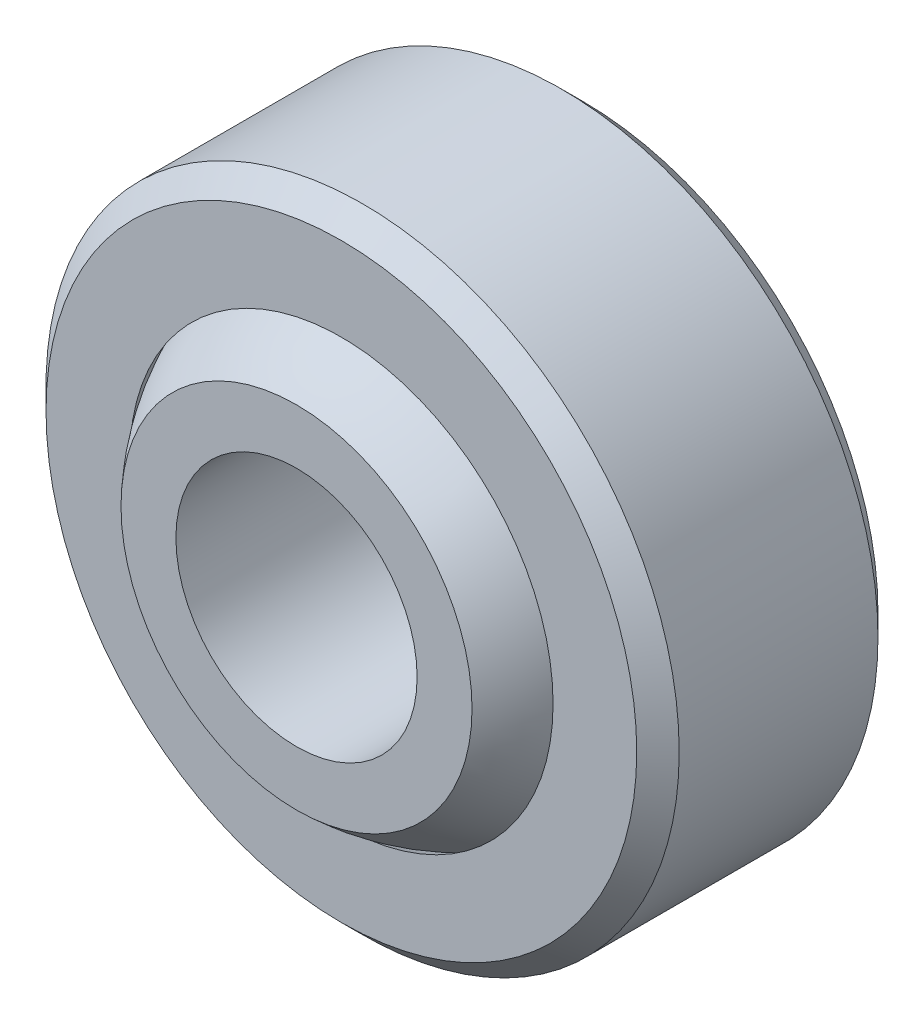
ISO-10303-21;
HEADER;
FILE_DESCRIPTION(('STEP AP214'),'2;1');
FILE_NAME('part.step','',(''),(''),'','','');
FILE_SCHEMA(('AUTOMOTIVE_DESIGN { 1 0 10303 214 1 1 1 1 }'));
ENDSEC;
DATA;
#1=APPLICATION_CONTEXT('core data for automotive mechanical design processes');
#2=APPLICATION_PROTOCOL_DEFINITION('international standard','automotive_design',2000,#1);
#3=PRODUCT_CONTEXT('',#1,'mechanical');
#4=PRODUCT('Part','Part','',(#3));
#5=PRODUCT_RELATED_PRODUCT_CATEGORY('part','',(#4));
#6=PRODUCT_DEFINITION_FORMATION('','',#4);
#7=PRODUCT_DEFINITION_CONTEXT('part definition',#1,'design');
#8=PRODUCT_DEFINITION('design','',#6,#7);
#9=PRODUCT_DEFINITION_SHAPE('','',#8);
#10=(LENGTH_UNIT() NAMED_UNIT(*) SI_UNIT(.MILLI.,.METRE.));
#11=(NAMED_UNIT(*) PLANE_ANGLE_UNIT() SI_UNIT($,.RADIAN.));
#12=(NAMED_UNIT(*) SI_UNIT($,.STERADIAN.) SOLID_ANGLE_UNIT());
#13=UNCERTAINTY_MEASURE_WITH_UNIT(LENGTH_MEASURE(1.E-05),#10,'distance_accuracy_value','');
#14=(GEOMETRIC_REPRESENTATION_CONTEXT(3) GLOBAL_UNCERTAINTY_ASSIGNED_CONTEXT((#13)) GLOBAL_UNIT_ASSIGNED_CONTEXT((#10,
#11,#12)) REPRESENTATION_CONTEXT('',''));
#15=CARTESIAN_POINT('',(0.,0.,0.));
#16=DIRECTION('',(0.,0.,1.));
#17=DIRECTION('',(1.,0.,0.));
#18=AXIS2_PLACEMENT_3D('',#15,#16,#17);
#19=CARTESIAN_POINT('',(0.,0.,0.));
#20=DIRECTION('',(0.,-1.,0.));
#21=DIRECTION('',(-1.,0.,0.));
#22=AXIS2_PLACEMENT_3D('',#19,#20,#21);
#23=SPHERICAL_SURFACE('',#22,6.35);
#24=CARTESIAN_POINT('',(0.,0.,0.));
#25=DIRECTION('',(0.,0.,1.));
#26=DIRECTION('',(0.,-1.,0.));
#27=AXIS2_PLACEMENT_3D('',#24,#25,#26);
#28=SPHERICAL_SURFACE('',#27,6.35);
#29=CARTESIAN_POINT('',(0.,0.,-4.3561));
#30=DIRECTION('',(0.,0.,1.));
#31=DIRECTION('',(0.,-1.,0.));
#32=AXIS2_PLACEMENT_3D('',#29,#30,#31);
#33=CIRCLE('',#32,4.62026977459109);
#34=CARTESIAN_POINT('',(0.,-4.62026977459109,-4.3561));
#35=VERTEX_POINT('',#34);
#36=EDGE_CURVE('E52',#35,#35,#33,.F.);
#37=ORIENTED_EDGE('',*,*,#36,.F.);
#38=EDGE_LOOP('',(#37));
#39=FACE_BOUND('',#38,.T.);
#40=CARTESIAN_POINT('',(0.,0.,4.3561));
#41=DIRECTION('',(0.,0.,-1.));
#42=DIRECTION('',(-1.,0.,0.));
#43=AXIS2_PLACEMENT_3D('',#40,#41,#42);
#44=CIRCLE('',#43,4.62026977459109);
#45=CARTESIAN_POINT('',(-4.62026977459109,0.,4.3561));
#46=VERTEX_POINT('',#45);
#47=EDGE_CURVE('E11',#46,#46,#44,.F.);
#48=ORIENTED_EDGE('',*,*,#47,.F.);
#49=EDGE_LOOP('',(#48));
#50=FACE_BOUND('',#49,.T.);
#51=ADVANCED_FACE('F40',(#39,#50),#28,.T.);
#52=CARTESIAN_POINT('',(0.,0.,-6.35));
#53=DIRECTION('',(0.,0.,1.));
#54=DIRECTION('',(1.,0.,0.));
#55=AXIS2_PLACEMENT_3D('',#52,#53,#54);
#56=CYLINDRICAL_SURFACE('',#55,3.175);
#57=CARTESIAN_POINT('',(0.,0.,-4.3561));
#58=DIRECTION('',(0.,0.,1.));
#59=DIRECTION('',(0.,-1.,0.));
#60=AXIS2_PLACEMENT_3D('',#57,#58,#59);
#61=CIRCLE('',#60,3.175);
#62=CARTESIAN_POINT('',(0.,-3.175,-4.3561));
#63=VERTEX_POINT('',#62);
#64=EDGE_CURVE('E43',#63,#63,#61,.F.);
#65=ORIENTED_EDGE('',*,*,#64,.T.);
#66=EDGE_LOOP('',(#65));
#67=FACE_BOUND('',#66,.T.);
#68=CARTESIAN_POINT('',(0.,0.,4.3561));
#69=DIRECTION('',(0.,0.,-1.));
#70=DIRECTION('',(-1.,0.,0.));
#71=AXIS2_PLACEMENT_3D('',#68,#69,#70);
#72=CIRCLE('',#71,3.175);
#73=CARTESIAN_POINT('',(-3.175,0.,4.3561));
#74=VERTEX_POINT('',#73);
#75=EDGE_CURVE('E47',#74,#74,#72,.F.);
#76=ORIENTED_EDGE('',*,*,#75,.T.);
#77=EDGE_LOOP('',(#76));
#78=FACE_BOUND('',#77,.T.);
#79=ADVANCED_FACE('F60',(#67,#78),#56,.F.);
#80=CARTESIAN_POINT('',(-8.33374,8.33374,4.3561));
#81=DIRECTION('',(0.,0.,-1.));
#82=DIRECTION('',(-1.,0.,0.));
#83=AXIS2_PLACEMENT_3D('',#80,#81,#82);
#84=PLANE('',#83);
#85=ORIENTED_EDGE('',*,*,#47,.T.);
#86=EDGE_LOOP('',(#85));
#87=FACE_BOUND('',#86,.T.);
#88=ORIENTED_EDGE('',*,*,#75,.F.);
#89=EDGE_LOOP('',(#88));
#90=FACE_BOUND('',#89,.T.);
#91=ADVANCED_FACE('F65',(#87,#90),#84,.F.);
#92=CARTESIAN_POINT('',(-8.33374,-8.33374,-4.3561));
#93=DIRECTION('',(0.,0.,1.));
#94=DIRECTION('',(0.,-1.,0.));
#95=AXIS2_PLACEMENT_3D('',#92,#93,#94);
#96=PLANE('',#95);
#97=ORIENTED_EDGE('',*,*,#36,.T.);
#98=EDGE_LOOP('',(#97));
#99=FACE_BOUND('',#98,.T.);
#100=ORIENTED_EDGE('',*,*,#64,.F.);
#101=EDGE_LOOP('',(#100));
#102=FACE_BOUND('',#101,.T.);
#103=ADVANCED_FACE('F63',(#99,#102),#96,.F.);
#104=CLOSED_SHELL('',(#51,#79,#91,#103));
#105=MANIFOLD_SOLID_BREP('B2',#104);
#106=CARTESIAN_POINT('',(0.,0.,3.175));
#107=DIRECTION('',(0.,0.,-1.));
#108=DIRECTION('',(-1.,0.,0.));
#109=AXIS2_PLACEMENT_3D('',#106,#107,#108);
#110=CYLINDRICAL_SURFACE('',#109,8.33374);
#111=CARTESIAN_POINT('',(0.,0.,2.6162));
#112=DIRECTION('',(0.,0.,1.));
#113=DIRECTION('',(1.,0.,0.));
#114=AXIS2_PLACEMENT_3D('',#111,#112,#113);
#115=CIRCLE('',#114,8.33374);
#116=CARTESIAN_POINT('',(8.33374,0.,2.6162));
#117=VERTEX_POINT('',#116);
#118=EDGE_CURVE('E108',#117,#117,#115,.F.);
#119=ORIENTED_EDGE('',*,*,#118,.T.);
#120=EDGE_LOOP('',(#119));
#121=FACE_BOUND('',#120,.T.);
#122=CARTESIAN_POINT('',(0.,0.,-2.6162));
#123=DIRECTION('',(0.,0.,1.));
#124=DIRECTION('',(1.,0.,0.));
#125=AXIS2_PLACEMENT_3D('',#122,#123,#124);
#126=CIRCLE('',#125,8.33374);
#127=CARTESIAN_POINT('',(8.33374,0.,-2.6162));
#128=VERTEX_POINT('',#127);
#129=EDGE_CURVE('E112',#128,#128,#126,.T.);
#130=ORIENTED_EDGE('',*,*,#129,.T.);
#131=EDGE_LOOP('',(#130));
#132=FACE_BOUND('',#131,.T.);
#133=ADVANCED_FACE('F101',(#121,#132),#110,.T.);
#134=CARTESIAN_POINT('',(0.,0.,3.175));
#135=DIRECTION('',(0.,0.,1.));
#136=DIRECTION('',(1.,0.,0.));
#137=AXIS2_PLACEMENT_3D('',#134,#135,#136);
#138=PLANE('',#137);
#139=CARTESIAN_POINT('',(0.,0.,3.175));
#140=DIRECTION('',(0.,0.,1.));
#141=DIRECTION('',(1.,0.,0.));
#142=AXIS2_PLACEMENT_3D('',#139,#140,#141);
#143=CIRCLE('',#142,7.77494);
#144=CARTESIAN_POINT('',(7.77494,0.,3.175));
#145=VERTEX_POINT('',#144);
#146=EDGE_CURVE('E116',#145,#145,#143,.T.);
#147=ORIENTED_EDGE('',*,*,#146,.T.);
#148=EDGE_LOOP('',(#147));
#149=FACE_BOUND('',#148,.T.);
#150=CARTESIAN_POINT('',(0.,0.,3.175));
#151=DIRECTION('',(0.,0.,1.));
#152=DIRECTION('',(1.,0.,0.));
#153=AXIS2_PLACEMENT_3D('',#150,#151,#152);
#154=CIRCLE('',#153,5.57246419907746);
#155=CARTESIAN_POINT('',(5.57246419907746,0.,3.175));
#156=VERTEX_POINT('',#155);
#157=EDGE_CURVE('E121',#156,#156,#154,.T.);
#158=ORIENTED_EDGE('',*,*,#157,.F.);
#159=EDGE_LOOP('',(#158));
#160=FACE_BOUND('',#159,.T.);
#161=ADVANCED_FACE('F131',(#149,#160),#138,.T.);
#162=CARTESIAN_POINT('',(0.,0.,-3.175));
#163=DIRECTION('',(0.,0.,1.));
#164=DIRECTION('',(1.,0.,0.));
#165=AXIS2_PLACEMENT_3D('',#162,#163,#164);
#166=PLANE('',#165);
#167=CARTESIAN_POINT('',(0.,0.,-3.175));
#168=DIRECTION('',(0.,0.,1.));
#169=DIRECTION('',(1.,0.,0.));
#170=AXIS2_PLACEMENT_3D('',#167,#168,#169);
#171=CIRCLE('',#170,7.77494);
#172=CARTESIAN_POINT('',(7.77494,0.,-3.175));
#173=VERTEX_POINT('',#172);
#174=EDGE_CURVE('E39',#173,#173,#171,.F.);
#175=ORIENTED_EDGE('',*,*,#174,.T.);
#176=EDGE_LOOP('',(#175));
#177=FACE_BOUND('',#176,.T.);
#178=CARTESIAN_POINT('',(0.,0.,-3.175));
#179=DIRECTION('',(0.,0.,1.));
#180=DIRECTION('',(1.,0.,0.));
#181=AXIS2_PLACEMENT_3D('',#178,#179,#180);
#182=CIRCLE('',#181,5.57246419907746);
#183=CARTESIAN_POINT('',(5.57246419907746,0.,-3.175));
#184=VERTEX_POINT('',#183);
#185=EDGE_CURVE('E122',#184,#184,#182,.T.);
#186=ORIENTED_EDGE('',*,*,#185,.T.);
#187=EDGE_LOOP('',(#186));
#188=FACE_BOUND('',#187,.T.);
#189=ADVANCED_FACE('F133',(#177,#188),#166,.F.);
#190=CARTESIAN_POINT('',(0.,0.,0.));
#191=DIRECTION('',(0.,-1.,0.));
#192=DIRECTION('',(-1.,0.,0.));
#193=AXIS2_PLACEMENT_3D('',#190,#191,#192);
#194=SPHERICAL_SURFACE('',#193,6.4135);
#195=CARTESIAN_POINT('',(0.,0.,0.));
#196=DIRECTION('',(0.,0.,1.));
#197=DIRECTION('',(1.,0.,0.));
#198=AXIS2_PLACEMENT_3D('',#195,#196,#197);
#199=SPHERICAL_SURFACE('',#198,6.4135);
#200=ORIENTED_EDGE('',*,*,#157,.T.);
#201=EDGE_LOOP('',(#200));
#202=FACE_BOUND('',#201,.T.);
#203=ORIENTED_EDGE('',*,*,#185,.F.);
#204=EDGE_LOOP('',(#203));
#205=FACE_BOUND('',#204,.T.);
#206=ADVANCED_FACE('F128',(#202,#205),#199,.F.);
#207=CARTESIAN_POINT('',(0.,0.,3.175));
#208=DIRECTION('',(0.,0.,-1.));
#209=DIRECTION('',(-1.,0.,0.));
#210=AXIS2_PLACEMENT_3D('',#207,#208,#209);
#211=CONICAL_SURFACE('',#210,7.77494,0.785398163397449);
#212=ORIENTED_EDGE('',*,*,#118,.F.);
#213=EDGE_LOOP('',(#212));
#214=FACE_BOUND('',#213,.T.);
#215=ORIENTED_EDGE('',*,*,#146,.F.);
#216=EDGE_LOOP('',(#215));
#217=FACE_BOUND('',#216,.T.);
#218=ADVANCED_FACE('F143',(#214,#217),#211,.T.);
#219=CARTESIAN_POINT('',(0.,0.,-2.6162));
#220=DIRECTION('',(0.,0.,1.));
#221=DIRECTION('',(1.,0.,0.));
#222=AXIS2_PLACEMENT_3D('',#219,#220,#221);
#223=CONICAL_SURFACE('',#222,8.33374,0.785398163397449);
#224=ORIENTED_EDGE('',*,*,#174,.F.);
#225=EDGE_LOOP('',(#224));
#226=FACE_BOUND('',#225,.T.);
#227=ORIENTED_EDGE('',*,*,#129,.F.);
#228=EDGE_LOOP('',(#227));
#229=FACE_BOUND('',#228,.T.);
#230=ADVANCED_FACE('F103',(#226,#229),#223,.T.);
#231=CLOSED_SHELL('',(#133,#161,#189,#206,#218,#230));
#232=MANIFOLD_SOLID_BREP('B6',#231);
#233=ADVANCED_BREP_SHAPE_REPRESENTATION('',(#18,#105,#232),#14);
#234=SHAPE_DEFINITION_REPRESENTATION(#9,#233);
ENDSEC;
END-ISO-10303-21;
